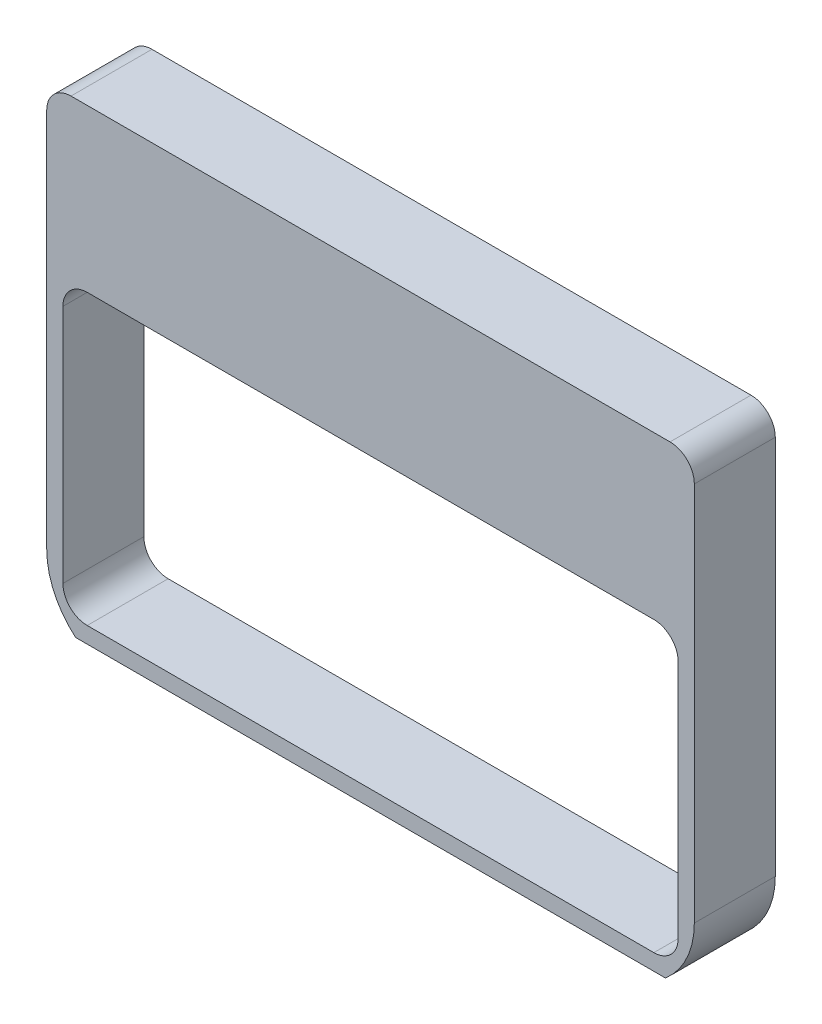
ISO-10303-21;
HEADER;
FILE_DESCRIPTION(('STEP AP214'),'2;1');
FILE_NAME('part.step','',(''),(''),'','','');
FILE_SCHEMA(('AUTOMOTIVE_DESIGN { 1 0 10303 214 1 1 1 1 }'));
ENDSEC;
DATA;
#1=APPLICATION_CONTEXT('core data for automotive mechanical design processes');
#2=APPLICATION_PROTOCOL_DEFINITION('international standard','automotive_design',2000,#1);
#3=PRODUCT_CONTEXT('',#1,'mechanical');
#4=PRODUCT('Part','Part','',(#3));
#5=PRODUCT_RELATED_PRODUCT_CATEGORY('part','',(#4));
#6=PRODUCT_DEFINITION_FORMATION('','',#4);
#7=PRODUCT_DEFINITION_CONTEXT('part definition',#1,'design');
#8=PRODUCT_DEFINITION('design','',#6,#7);
#9=PRODUCT_DEFINITION_SHAPE('','',#8);
#10=(LENGTH_UNIT() NAMED_UNIT(*) SI_UNIT(.MILLI.,.METRE.));
#11=(NAMED_UNIT(*) PLANE_ANGLE_UNIT() SI_UNIT($,.RADIAN.));
#12=(NAMED_UNIT(*) SI_UNIT($,.STERADIAN.) SOLID_ANGLE_UNIT());
#13=UNCERTAINTY_MEASURE_WITH_UNIT(LENGTH_MEASURE(1.E-05),#10,'distance_accuracy_value','');
#14=(GEOMETRIC_REPRESENTATION_CONTEXT(3) GLOBAL_UNCERTAINTY_ASSIGNED_CONTEXT((#13)) GLOBAL_UNIT_ASSIGNED_CONTEXT((#10,
#11,#12)) REPRESENTATION_CONTEXT('',''));
#15=CARTESIAN_POINT('',(0.,0.,0.));
#16=DIRECTION('',(0.,0.,1.));
#17=DIRECTION('',(1.,0.,0.));
#18=AXIS2_PLACEMENT_3D('',#15,#16,#17);
#19=CARTESIAN_POINT('',(27.4361140510487,78.3989030130212,10.));
#20=DIRECTION('',(-1.,0.,0.));
#21=DIRECTION('',(0.,0.,1.));
#22=AXIS2_PLACEMENT_3D('',#19,#20,#21);
#23=PLANE('',#22);
#24=DIRECTION('',(0.,1.,0.));
#25=VECTOR('',#24,1.);
#26=CARTESIAN_POINT('',(27.4361140510487,78.3989030130212,0.));
#27=LINE('',#26,#25);
#28=CARTESIAN_POINT('',(27.4361140510487,43.4189030130212,0.));
#29=VERTEX_POINT('',#28);
#30=CARTESIAN_POINT('',(27.4361140510487,90.3989030130211,0.));
#31=VERTEX_POINT('',#30);
#32=EDGE_CURVE('E220',#29,#31,#27,.T.);
#33=ORIENTED_EDGE('',*,*,#32,.T.);
#34=DIRECTION('',(0.,0.,-1.));
#35=VECTOR('',#34,1.);
#36=CARTESIAN_POINT('',(27.4361140510487,90.3989030130211,10.));
#37=LINE('',#36,#35);
#38=CARTESIAN_POINT('',(27.4361140510487,90.3989030130211,10.));
#39=VERTEX_POINT('',#38);
#40=EDGE_CURVE('E11',#39,#31,#37,.T.);
#41=ORIENTED_EDGE('',*,*,#40,.F.);
#42=DIRECTION('',(0.,-1.,0.));
#43=VECTOR('',#42,1.);
#44=CARTESIAN_POINT('',(27.4361140510487,78.3989030130212,10.));
#45=LINE('',#44,#43);
#46=CARTESIAN_POINT('',(27.4361140510487,43.4189030130212,10.));
#47=VERTEX_POINT('',#46);
#48=EDGE_CURVE('E216',#39,#47,#45,.T.);
#49=ORIENTED_EDGE('',*,*,#48,.T.);
#50=DIRECTION('',(0.,0.,-1.));
#51=VECTOR('',#50,1.);
#52=CARTESIAN_POINT('',(27.4361140510487,43.4189030130212,10.));
#53=LINE('',#52,#51);
#54=EDGE_CURVE('E37',#47,#29,#53,.T.);
#55=ORIENTED_EDGE('',*,*,#54,.T.);
#56=EDGE_LOOP('',(#33,#41,#49,#55));
#57=FACE_BOUND('',#56,.T.);
#58=ADVANCED_FACE('F33',(#57),#23,.F.);
#59=CARTESIAN_POINT('',(24.4361140510487,90.3989030130211,10.));
#60=DIRECTION('',(0.,0.,-1.));
#61=DIRECTION('',(-1.,0.,0.));
#62=AXIS2_PLACEMENT_3D('',#59,#60,#61);
#63=CYLINDRICAL_SURFACE('',#62,3.);
#64=CARTESIAN_POINT('',(24.4361140510487,90.3989030130211,0.));
#65=DIRECTION('',(0.,0.,-1.));
#66=DIRECTION('',(-1.,0.,0.));
#67=AXIS2_PLACEMENT_3D('',#64,#65,#66);
#68=CIRCLE('',#67,3.);
#69=CARTESIAN_POINT('',(24.4361140510487,93.3989030130211,0.));
#70=VERTEX_POINT('',#69);
#71=EDGE_CURVE('E256',#70,#31,#68,.T.);
#72=ORIENTED_EDGE('',*,*,#71,.F.);
#73=DIRECTION('',(0.,0.,-1.));
#74=VECTOR('',#73,1.);
#75=CARTESIAN_POINT('',(24.4361140510487,93.3989030130211,10.));
#76=LINE('',#75,#74);
#77=CARTESIAN_POINT('',(24.4361140510487,93.3989030130211,10.));
#78=VERTEX_POINT('',#77);
#79=EDGE_CURVE('E42',#78,#70,#76,.T.);
#80=ORIENTED_EDGE('',*,*,#79,.F.);
#81=CARTESIAN_POINT('',(24.4361140510487,90.3989030130211,10.));
#82=DIRECTION('',(0.,0.,-1.));
#83=DIRECTION('',(-1.,0.,0.));
#84=AXIS2_PLACEMENT_3D('',#81,#82,#83);
#85=CIRCLE('',#84,3.);
#86=EDGE_CURVE('E236',#78,#39,#85,.T.);
#87=ORIENTED_EDGE('',*,*,#86,.T.);
#88=ORIENTED_EDGE('',*,*,#40,.T.);
#89=EDGE_LOOP('',(#72,#80,#87,#88));
#90=FACE_BOUND('',#89,.T.);
#91=ADVANCED_FACE('F302',(#90),#63,.T.);
#92=CARTESIAN_POINT('',(-49.5638859489513,93.3989030130211,10.));
#93=DIRECTION('',(0.,1.,0.));
#94=DIRECTION('',(0.,0.,1.));
#95=AXIS2_PLACEMENT_3D('',#92,#93,#94);
#96=PLANE('',#95);
#97=DIRECTION('',(1.,0.,0.));
#98=VECTOR('',#97,1.);
#99=CARTESIAN_POINT('',(-49.5638859489513,93.3989030130211,0.));
#100=LINE('',#99,#98);
#101=CARTESIAN_POINT('',(-49.5638859489513,93.3989030130211,0.));
#102=VERTEX_POINT('',#101);
#103=EDGE_CURVE('E253',#102,#70,#100,.T.);
#104=ORIENTED_EDGE('',*,*,#103,.F.);
#105=DIRECTION('',(0.,0.,-1.));
#106=VECTOR('',#105,1.);
#107=CARTESIAN_POINT('',(-49.5638859489513,93.3989030130211,10.));
#108=LINE('',#107,#106);
#109=CARTESIAN_POINT('',(-49.5638859489513,93.3989030130211,10.));
#110=VERTEX_POINT('',#109);
#111=EDGE_CURVE('E262',#110,#102,#108,.T.);
#112=ORIENTED_EDGE('',*,*,#111,.F.);
#113=DIRECTION('',(1.,0.,0.));
#114=VECTOR('',#113,1.);
#115=CARTESIAN_POINT('',(-49.5638859489513,93.3989030130211,10.));
#116=LINE('',#115,#114);
#117=EDGE_CURVE('E233',#110,#78,#116,.T.);
#118=ORIENTED_EDGE('',*,*,#117,.T.);
#119=ORIENTED_EDGE('',*,*,#79,.T.);
#120=EDGE_LOOP('',(#104,#112,#118,#119));
#121=FACE_BOUND('',#120,.T.);
#122=ADVANCED_FACE('F299',(#121),#96,.T.);
#123=CARTESIAN_POINT('',(-49.5638859489513,90.3989030130211,10.));
#124=DIRECTION('',(0.,0.,-1.));
#125=DIRECTION('',(-1.,0.,0.));
#126=AXIS2_PLACEMENT_3D('',#123,#124,#125);
#127=CYLINDRICAL_SURFACE('',#126,3.);
#128=CARTESIAN_POINT('',(-49.5638859489513,90.3989030130211,0.));
#129=DIRECTION('',(0.,0.,-1.));
#130=DIRECTION('',(-1.,0.,0.));
#131=AXIS2_PLACEMENT_3D('',#128,#129,#130);
#132=CIRCLE('',#131,3.);
#133=CARTESIAN_POINT('',(-52.5638859489513,90.3989030130211,0.));
#134=VERTEX_POINT('',#133);
#135=EDGE_CURVE('E250',#134,#102,#132,.T.);
#136=ORIENTED_EDGE('',*,*,#135,.F.);
#137=DIRECTION('',(0.,0.,-1.));
#138=VECTOR('',#137,1.);
#139=CARTESIAN_POINT('',(-52.5638859489513,90.3989030130211,10.));
#140=LINE('',#139,#138);
#141=CARTESIAN_POINT('',(-52.5638859489513,90.3989030130211,10.));
#142=VERTEX_POINT('',#141);
#143=EDGE_CURVE('E264',#142,#134,#140,.T.);
#144=ORIENTED_EDGE('',*,*,#143,.F.);
#145=CARTESIAN_POINT('',(-49.5638859489513,90.3989030130211,10.));
#146=DIRECTION('',(0.,0.,-1.));
#147=DIRECTION('',(-1.,0.,0.));
#148=AXIS2_PLACEMENT_3D('',#145,#146,#147);
#149=CIRCLE('',#148,3.);
#150=EDGE_CURVE('E230',#142,#110,#149,.T.);
#151=ORIENTED_EDGE('',*,*,#150,.T.);
#152=ORIENTED_EDGE('',*,*,#111,.T.);
#153=EDGE_LOOP('',(#136,#144,#151,#152));
#154=FACE_BOUND('',#153,.T.);
#155=ADVANCED_FACE('F295',(#154),#127,.T.);
#156=CARTESIAN_POINT('',(-52.5638859489513,78.3989030130212,10.));
#157=DIRECTION('',(-1.,0.,0.));
#158=DIRECTION('',(0.,0.,1.));
#159=AXIS2_PLACEMENT_3D('',#156,#157,#158);
#160=PLANE('',#159);
#161=DIRECTION('',(0.,1.,0.));
#162=VECTOR('',#161,1.);
#163=CARTESIAN_POINT('',(-52.5638859489513,78.3989030130212,0.));
#164=LINE('',#163,#162);
#165=CARTESIAN_POINT('',(-52.5638859489513,43.4189030130212,0.));
#166=VERTEX_POINT('',#165);
#167=EDGE_CURVE('E247',#166,#134,#164,.T.);
#168=ORIENTED_EDGE('',*,*,#167,.F.);
#169=DIRECTION('',(0.,0.,-1.));
#170=VECTOR('',#169,1.);
#171=CARTESIAN_POINT('',(-52.5638859489513,43.4189030130212,10.));
#172=LINE('',#171,#170);
#173=CARTESIAN_POINT('',(-52.5638859489513,43.4189030130212,10.));
#174=VERTEX_POINT('',#173);
#175=EDGE_CURVE('E266',#174,#166,#172,.T.);
#176=ORIENTED_EDGE('',*,*,#175,.F.);
#177=DIRECTION('',(0.,-1.,0.));
#178=VECTOR('',#177,1.);
#179=CARTESIAN_POINT('',(-52.5638859489513,78.3989030130212,10.));
#180=LINE('',#179,#178);
#181=EDGE_CURVE('E228',#142,#174,#180,.T.);
#182=ORIENTED_EDGE('',*,*,#181,.F.);
#183=ORIENTED_EDGE('',*,*,#143,.T.);
#184=EDGE_LOOP('',(#168,#176,#182,#183));
#185=FACE_BOUND('',#184,.T.);
#186=ADVANCED_FACE('F291',(#185),#160,.T.);
#187=CARTESIAN_POINT('',(-42.5638859489513,43.4189030130212,10.));
#188=DIRECTION('',(0.,0.,-1.));
#189=DIRECTION('',(-1.,0.,0.));
#190=AXIS2_PLACEMENT_3D('',#187,#188,#189);
#191=CYLINDRICAL_SURFACE('',#190,10.);
#192=CARTESIAN_POINT('',(-42.5638859489513,43.4189030130212,0.));
#193=DIRECTION('',(0.,0.,-1.));
#194=DIRECTION('',(-1.,0.,0.));
#195=AXIS2_PLACEMENT_3D('',#192,#193,#194);
#196=CIRCLE('',#195,10.);
#197=CARTESIAN_POINT('',(-48.9917620458167,35.7584585818314,0.));
#198=VERTEX_POINT('',#197);
#199=EDGE_CURVE('E244',#198,#166,#196,.T.);
#200=ORIENTED_EDGE('',*,*,#199,.F.);
#201=DIRECTION('',(0.,0.,-1.));
#202=VECTOR('',#201,1.);
#203=CARTESIAN_POINT('',(-48.9917620458167,35.7584585818314,10.));
#204=LINE('',#203,#202);
#205=CARTESIAN_POINT('',(-48.9917620458167,35.7584585818314,10.));
#206=VERTEX_POINT('',#205);
#207=EDGE_CURVE('E269',#206,#198,#204,.T.);
#208=ORIENTED_EDGE('',*,*,#207,.F.);
#209=CARTESIAN_POINT('',(-42.5638859489513,43.4189030130212,10.));
#210=DIRECTION('',(0.,0.,-1.));
#211=DIRECTION('',(-1.,0.,0.));
#212=AXIS2_PLACEMENT_3D('',#209,#210,#211);
#213=CIRCLE('',#212,10.);
#214=EDGE_CURVE('E225',#206,#174,#213,.T.);
#215=ORIENTED_EDGE('',*,*,#214,.T.);
#216=ORIENTED_EDGE('',*,*,#175,.T.);
#217=EDGE_LOOP('',(#200,#208,#215,#216));
#218=FACE_BOUND('',#217,.T.);
#219=ADVANCED_FACE('F287',(#218),#191,.T.);
#220=CARTESIAN_POINT('',(23.8639901479141,35.7584585818314,10.));
#221=DIRECTION('',(0.,-1.,0.));
#222=DIRECTION('',(0.,0.,-1.));
#223=AXIS2_PLACEMENT_3D('',#220,#221,#222);
#224=PLANE('',#223);
#225=DIRECTION('',(-1.,0.,0.));
#226=VECTOR('',#225,1.);
#227=CARTESIAN_POINT('',(23.8639901479141,35.7584585818314,0.));
#228=LINE('',#227,#226);
#229=CARTESIAN_POINT('',(23.8639901479141,35.7584585818314,0.));
#230=VERTEX_POINT('',#229);
#231=EDGE_CURVE('E241',#230,#198,#228,.T.);
#232=ORIENTED_EDGE('',*,*,#231,.F.);
#233=DIRECTION('',(0.,0.,-1.));
#234=VECTOR('',#233,1.);
#235=CARTESIAN_POINT('',(23.8639901479141,35.7584585818314,10.));
#236=LINE('',#235,#234);
#237=CARTESIAN_POINT('',(23.8639901479141,35.7584585818314,10.));
#238=VERTEX_POINT('',#237);
#239=EDGE_CURVE('E270',#238,#230,#236,.T.);
#240=ORIENTED_EDGE('',*,*,#239,.F.);
#241=DIRECTION('',(-1.,0.,0.));
#242=VECTOR('',#241,1.);
#243=CARTESIAN_POINT('',(23.8639901479141,35.7584585818314,10.));
#244=LINE('',#243,#242);
#245=EDGE_CURVE('E222',#238,#206,#244,.T.);
#246=ORIENTED_EDGE('',*,*,#245,.T.);
#247=ORIENTED_EDGE('',*,*,#207,.T.);
#248=EDGE_LOOP('',(#232,#240,#246,#247));
#249=FACE_BOUND('',#248,.T.);
#250=ADVANCED_FACE('F282',(#249),#224,.T.);
#251=CARTESIAN_POINT('',(17.4361140510487,43.4189030130212,10.));
#252=DIRECTION('',(0.,0.,-1.));
#253=DIRECTION('',(-1.,0.,0.));
#254=AXIS2_PLACEMENT_3D('',#251,#252,#253);
#255=CYLINDRICAL_SURFACE('',#254,10.);
#256=CARTESIAN_POINT('',(17.4361140510487,43.4189030130212,0.));
#257=DIRECTION('',(0.,0.,1.));
#258=DIRECTION('',(1.,0.,0.));
#259=AXIS2_PLACEMENT_3D('',#256,#257,#258);
#260=CIRCLE('',#259,10.);
#261=EDGE_CURVE('E204',#230,#29,#260,.T.);
#262=ORIENTED_EDGE('',*,*,#261,.T.);
#263=ORIENTED_EDGE('',*,*,#54,.F.);
#264=CARTESIAN_POINT('',(17.4361140510487,43.4189030130212,10.));
#265=DIRECTION('',(0.,0.,1.));
#266=DIRECTION('',(1.,0.,0.));
#267=AXIS2_PLACEMENT_3D('',#264,#265,#266);
#268=CIRCLE('',#267,10.);
#269=EDGE_CURVE('E219',#238,#47,#268,.T.);
#270=ORIENTED_EDGE('',*,*,#269,.F.);
#271=ORIENTED_EDGE('',*,*,#239,.T.);
#272=EDGE_LOOP('',(#262,#263,#270,#271));
#273=FACE_BOUND('',#272,.T.);
#274=ADVANCED_FACE('F35',(#273),#255,.T.);
#275=CARTESIAN_POINT('',(17.4361140510487,43.4189030130212,10.));
#276=DIRECTION('',(0.,0.,1.));
#277=DIRECTION('',(1.,0.,0.));
#278=AXIS2_PLACEMENT_3D('',#275,#276,#277);
#279=PLANE('',#278);
#280=CARTESIAN_POINT('',(-47.5638859489513,70.3989030130211,10.));
#281=DIRECTION('',(0.,0.,-1.));
#282=DIRECTION('',(1.,0.,0.));
#283=AXIS2_PLACEMENT_3D('',#280,#281,#282);
#284=CIRCLE('',#283,3.);
#285=CARTESIAN_POINT('',(-50.5638859489513,70.3989030130211,10.));
#286=VERTEX_POINT('',#285);
#287=CARTESIAN_POINT('',(-47.5638859489513,73.3989030130211,10.));
#288=VERTEX_POINT('',#287);
#289=EDGE_CURVE('E149',#286,#288,#284,.T.);
#290=ORIENTED_EDGE('',*,*,#289,.T.);
#291=DIRECTION('',(1.,0.,0.));
#292=VECTOR('',#291,1.);
#293=CARTESIAN_POINT('',(22.4361140510487,73.3989030130211,10.));
#294=LINE('',#293,#292);
#295=CARTESIAN_POINT('',(22.4361140510487,73.3989030130211,10.));
#296=VERTEX_POINT('',#295);
#297=EDGE_CURVE('E158',#288,#296,#294,.T.);
#298=ORIENTED_EDGE('',*,*,#297,.T.);
#299=CARTESIAN_POINT('',(22.4361140510487,70.3989030130211,10.));
#300=DIRECTION('',(0.,0.,-1.));
#301=DIRECTION('',(-1.,0.,0.));
#302=AXIS2_PLACEMENT_3D('',#299,#300,#301);
#303=CIRCLE('',#302,3.);
#304=CARTESIAN_POINT('',(25.4361140510487,70.3989030130211,10.));
#305=VERTEX_POINT('',#304);
#306=EDGE_CURVE('E50',#296,#305,#303,.T.);
#307=ORIENTED_EDGE('',*,*,#306,.T.);
#308=DIRECTION('',(0.,-1.,0.));
#309=VECTOR('',#308,1.);
#310=CARTESIAN_POINT('',(25.4361140510487,70.3989030130211,10.));
#311=LINE('',#310,#309);
#312=CARTESIAN_POINT('',(25.4361140510487,40.7584585818314,10.));
#313=VERTEX_POINT('',#312);
#314=EDGE_CURVE('E173',#305,#313,#311,.T.);
#315=ORIENTED_EDGE('',*,*,#314,.T.);
#316=CARTESIAN_POINT('',(22.4361140510487,40.7584585818314,10.));
#317=DIRECTION('',(0.,0.,-1.));
#318=DIRECTION('',(-1.,0.,0.));
#319=AXIS2_PLACEMENT_3D('',#316,#317,#318);
#320=CIRCLE('',#319,3.);
#321=CARTESIAN_POINT('',(22.4361140510487,37.7584585818314,10.));
#322=VERTEX_POINT('',#321);
#323=EDGE_CURVE('E176',#313,#322,#320,.T.);
#324=ORIENTED_EDGE('',*,*,#323,.T.);
#325=DIRECTION('',(-1.,0.,0.));
#326=VECTOR('',#325,1.);
#327=CARTESIAN_POINT('',(22.4361140510487,37.7584585818314,10.));
#328=LINE('',#327,#326);
#329=CARTESIAN_POINT('',(-47.5638859489513,37.7584585818314,10.));
#330=VERTEX_POINT('',#329);
#331=EDGE_CURVE('E179',#322,#330,#328,.T.);
#332=ORIENTED_EDGE('',*,*,#331,.T.);
#333=CARTESIAN_POINT('',(-47.5638859489513,40.7584585818314,10.));
#334=DIRECTION('',(0.,0.,-1.));
#335=DIRECTION('',(-1.,0.,0.));
#336=AXIS2_PLACEMENT_3D('',#333,#334,#335);
#337=CIRCLE('',#336,3.);
#338=CARTESIAN_POINT('',(-50.5638859489513,40.7584585818314,10.));
#339=VERTEX_POINT('',#338);
#340=EDGE_CURVE('E182',#330,#339,#337,.T.);
#341=ORIENTED_EDGE('',*,*,#340,.T.);
#342=DIRECTION('',(0.,1.,0.));
#343=VECTOR('',#342,1.);
#344=CARTESIAN_POINT('',(-50.5638859489513,70.3989030130211,10.));
#345=LINE('',#344,#343);
#346=EDGE_CURVE('E155',#339,#286,#345,.T.);
#347=ORIENTED_EDGE('',*,*,#346,.T.);
#348=EDGE_LOOP('',(#290,#298,#307,#315,#324,#332,#341,#347));
#349=FACE_BOUND('',#348,.T.);
#350=ORIENTED_EDGE('',*,*,#48,.F.);
#351=ORIENTED_EDGE('',*,*,#86,.F.);
#352=ORIENTED_EDGE('',*,*,#117,.F.);
#353=ORIENTED_EDGE('',*,*,#150,.F.);
#354=ORIENTED_EDGE('',*,*,#181,.T.);
#355=ORIENTED_EDGE('',*,*,#214,.F.);
#356=ORIENTED_EDGE('',*,*,#245,.F.);
#357=ORIENTED_EDGE('',*,*,#269,.T.);
#358=EDGE_LOOP('',(#350,#351,#352,#353,#354,#355,#356,#357));
#359=FACE_BOUND('',#358,.T.);
#360=ADVANCED_FACE('F162',(#349,#359),#279,.T.);
#361=CARTESIAN_POINT('',(17.4361140510487,43.4189030130212,0.));
#362=DIRECTION('',(0.,0.,1.));
#363=DIRECTION('',(1.,0.,0.));
#364=AXIS2_PLACEMENT_3D('',#361,#362,#363);
#365=PLANE('',#364);
#366=DIRECTION('',(1.,0.,0.));
#367=VECTOR('',#366,1.);
#368=CARTESIAN_POINT('',(22.4361140510487,73.3989030130211,0.));
#369=LINE('',#368,#367);
#370=CARTESIAN_POINT('',(-47.5638859489513,73.3989030130211,0.));
#371=VERTEX_POINT('',#370);
#372=CARTESIAN_POINT('',(22.4361140510487,73.3989030130211,0.));
#373=VERTEX_POINT('',#372);
#374=EDGE_CURVE('E186',#371,#373,#369,.T.);
#375=ORIENTED_EDGE('',*,*,#374,.F.);
#376=CARTESIAN_POINT('',(-47.5638859489513,70.3989030130211,0.));
#377=DIRECTION('',(0.,0.,-1.));
#378=DIRECTION('',(1.,0.,0.));
#379=AXIS2_PLACEMENT_3D('',#376,#377,#378);
#380=CIRCLE('',#379,3.);
#381=CARTESIAN_POINT('',(-50.5638859489513,70.3989030130211,0.));
#382=VERTEX_POINT('',#381);
#383=EDGE_CURVE('E58',#382,#371,#380,.T.);
#384=ORIENTED_EDGE('',*,*,#383,.F.);
#385=DIRECTION('',(0.,1.,0.));
#386=VECTOR('',#385,1.);
#387=CARTESIAN_POINT('',(-50.5638859489513,70.3989030130211,0.));
#388=LINE('',#387,#386);
#389=CARTESIAN_POINT('',(-50.5638859489513,40.7584585818314,0.));
#390=VERTEX_POINT('',#389);
#391=EDGE_CURVE('E166',#390,#382,#388,.T.);
#392=ORIENTED_EDGE('',*,*,#391,.F.);
#393=CARTESIAN_POINT('',(-47.5638859489513,40.7584585818314,0.));
#394=DIRECTION('',(0.,0.,-1.));
#395=DIRECTION('',(-1.,0.,0.));
#396=AXIS2_PLACEMENT_3D('',#393,#394,#395);
#397=CIRCLE('',#396,3.);
#398=CARTESIAN_POINT('',(-47.5638859489513,37.7584585818314,0.));
#399=VERTEX_POINT('',#398);
#400=EDGE_CURVE('E169',#399,#390,#397,.T.);
#401=ORIENTED_EDGE('',*,*,#400,.F.);
#402=DIRECTION('',(-1.,0.,0.));
#403=VECTOR('',#402,1.);
#404=CARTESIAN_POINT('',(22.4361140510487,37.7584585818314,0.));
#405=LINE('',#404,#403);
#406=CARTESIAN_POINT('',(22.4361140510487,37.7584585818314,0.));
#407=VERTEX_POINT('',#406);
#408=EDGE_CURVE('E197',#407,#399,#405,.T.);
#409=ORIENTED_EDGE('',*,*,#408,.F.);
#410=CARTESIAN_POINT('',(22.4361140510487,40.7584585818314,0.));
#411=DIRECTION('',(0.,0.,-1.));
#412=DIRECTION('',(-1.,0.,0.));
#413=AXIS2_PLACEMENT_3D('',#410,#411,#412);
#414=CIRCLE('',#413,3.);
#415=CARTESIAN_POINT('',(25.4361140510487,40.7584585818314,0.));
#416=VERTEX_POINT('',#415);
#417=EDGE_CURVE('E194',#416,#407,#414,.T.);
#418=ORIENTED_EDGE('',*,*,#417,.F.);
#419=DIRECTION('',(0.,-1.,0.));
#420=VECTOR('',#419,1.);
#421=CARTESIAN_POINT('',(25.4361140510487,70.3989030130211,0.));
#422=LINE('',#421,#420);
#423=CARTESIAN_POINT('',(25.4361140510487,70.3989030130211,0.));
#424=VERTEX_POINT('',#423);
#425=EDGE_CURVE('E191',#424,#416,#422,.T.);
#426=ORIENTED_EDGE('',*,*,#425,.F.);
#427=CARTESIAN_POINT('',(22.4361140510487,70.3989030130211,0.));
#428=DIRECTION('',(0.,0.,-1.));
#429=DIRECTION('',(-1.,0.,0.));
#430=AXIS2_PLACEMENT_3D('',#427,#428,#429);
#431=CIRCLE('',#430,3.);
#432=EDGE_CURVE('E188',#373,#424,#431,.T.);
#433=ORIENTED_EDGE('',*,*,#432,.F.);
#434=EDGE_LOOP('',(#375,#384,#392,#401,#409,#418,#426,#433));
#435=FACE_BOUND('',#434,.T.);
#436=ORIENTED_EDGE('',*,*,#32,.F.);
#437=ORIENTED_EDGE('',*,*,#261,.F.);
#438=ORIENTED_EDGE('',*,*,#231,.T.);
#439=ORIENTED_EDGE('',*,*,#199,.T.);
#440=ORIENTED_EDGE('',*,*,#167,.T.);
#441=ORIENTED_EDGE('',*,*,#135,.T.);
#442=ORIENTED_EDGE('',*,*,#103,.T.);
#443=ORIENTED_EDGE('',*,*,#71,.T.);
#444=EDGE_LOOP('',(#436,#437,#438,#439,#440,#441,#442,#443));
#445=FACE_BOUND('',#444,.T.);
#446=ADVANCED_FACE('F280',(#435,#445),#365,.F.);
#447=CARTESIAN_POINT('',(-47.5638859489513,70.3989030130211,10.));
#448=DIRECTION('',(0.,0.,-1.));
#449=DIRECTION('',(-1.,0.,0.));
#450=AXIS2_PLACEMENT_3D('',#447,#448,#449);
#451=CYLINDRICAL_SURFACE('',#450,3.);
#452=ORIENTED_EDGE('',*,*,#383,.T.);
#453=DIRECTION('',(0.,0.,-1.));
#454=VECTOR('',#453,1.);
#455=CARTESIAN_POINT('',(-47.5638859489513,73.3989030130211,10.));
#456=LINE('',#455,#454);
#457=EDGE_CURVE('E145',#288,#371,#456,.T.);
#458=ORIENTED_EDGE('',*,*,#457,.F.);
#459=ORIENTED_EDGE('',*,*,#289,.F.);
#460=DIRECTION('',(0.,0.,-1.));
#461=VECTOR('',#460,1.);
#462=CARTESIAN_POINT('',(-50.5638859489513,70.3989030130211,10.));
#463=LINE('',#462,#461);
#464=EDGE_CURVE('E202',#286,#382,#463,.T.);
#465=ORIENTED_EDGE('',*,*,#464,.T.);
#466=EDGE_LOOP('',(#452,#458,#459,#465));
#467=FACE_BOUND('',#466,.T.);
#468=ADVANCED_FACE('F147',(#467),#451,.F.);
#469=CARTESIAN_POINT('',(-50.5638859489513,70.3989030130211,10.));
#470=DIRECTION('',(-1.,0.,0.));
#471=DIRECTION('',(0.,0.,1.));
#472=AXIS2_PLACEMENT_3D('',#469,#470,#471);
#473=PLANE('',#472);
#474=ORIENTED_EDGE('',*,*,#391,.T.);
#475=ORIENTED_EDGE('',*,*,#464,.F.);
#476=ORIENTED_EDGE('',*,*,#346,.F.);
#477=DIRECTION('',(0.,0.,-1.));
#478=VECTOR('',#477,1.);
#479=CARTESIAN_POINT('',(-50.5638859489513,40.7584585818314,10.));
#480=LINE('',#479,#478);
#481=EDGE_CURVE('E205',#339,#390,#480,.T.);
#482=ORIENTED_EDGE('',*,*,#481,.T.);
#483=EDGE_LOOP('',(#474,#475,#476,#482));
#484=FACE_BOUND('',#483,.T.);
#485=ADVANCED_FACE('F355',(#484),#473,.F.);
#486=CARTESIAN_POINT('',(-47.5638859489513,40.7584585818314,10.));
#487=DIRECTION('',(0.,0.,-1.));
#488=DIRECTION('',(-1.,0.,0.));
#489=AXIS2_PLACEMENT_3D('',#486,#487,#488);
#490=CYLINDRICAL_SURFACE('',#489,3.);
#491=ORIENTED_EDGE('',*,*,#400,.T.);
#492=ORIENTED_EDGE('',*,*,#481,.F.);
#493=ORIENTED_EDGE('',*,*,#340,.F.);
#494=DIRECTION('',(0.,0.,-1.));
#495=VECTOR('',#494,1.);
#496=CARTESIAN_POINT('',(-47.5638859489513,37.7584585818314,10.));
#497=LINE('',#496,#495);
#498=EDGE_CURVE('E207',#330,#399,#497,.T.);
#499=ORIENTED_EDGE('',*,*,#498,.T.);
#500=EDGE_LOOP('',(#491,#492,#493,#499));
#501=FACE_BOUND('',#500,.T.);
#502=ADVANCED_FACE('F363',(#501),#490,.F.);
#503=CARTESIAN_POINT('',(22.4361140510487,37.7584585818314,10.));
#504=DIRECTION('',(0.,-1.,0.));
#505=DIRECTION('',(0.,0.,-1.));
#506=AXIS2_PLACEMENT_3D('',#503,#504,#505);
#507=PLANE('',#506);
#508=ORIENTED_EDGE('',*,*,#408,.T.);
#509=ORIENTED_EDGE('',*,*,#498,.F.);
#510=ORIENTED_EDGE('',*,*,#331,.F.);
#511=DIRECTION('',(0.,0.,-1.));
#512=VECTOR('',#511,1.);
#513=CARTESIAN_POINT('',(22.4361140510487,37.7584585818314,10.));
#514=LINE('',#513,#512);
#515=EDGE_CURVE('E209',#322,#407,#514,.T.);
#516=ORIENTED_EDGE('',*,*,#515,.T.);
#517=EDGE_LOOP('',(#508,#509,#510,#516));
#518=FACE_BOUND('',#517,.T.);
#519=ADVANCED_FACE('F373',(#518),#507,.F.);
#520=CARTESIAN_POINT('',(22.4361140510487,40.7584585818314,10.));
#521=DIRECTION('',(0.,0.,-1.));
#522=DIRECTION('',(-1.,0.,0.));
#523=AXIS2_PLACEMENT_3D('',#520,#521,#522);
#524=CYLINDRICAL_SURFACE('',#523,3.);
#525=ORIENTED_EDGE('',*,*,#417,.T.);
#526=ORIENTED_EDGE('',*,*,#515,.F.);
#527=ORIENTED_EDGE('',*,*,#323,.F.);
#528=DIRECTION('',(0.,0.,-1.));
#529=VECTOR('',#528,1.);
#530=CARTESIAN_POINT('',(25.4361140510487,40.7584585818314,10.));
#531=LINE('',#530,#529);
#532=EDGE_CURVE('E211',#313,#416,#531,.T.);
#533=ORIENTED_EDGE('',*,*,#532,.T.);
#534=EDGE_LOOP('',(#525,#526,#527,#533));
#535=FACE_BOUND('',#534,.T.);
#536=ADVANCED_FACE('F383',(#535),#524,.F.);
#537=CARTESIAN_POINT('',(25.4361140510487,70.3989030130211,10.));
#538=DIRECTION('',(1.,0.,0.));
#539=DIRECTION('',(0.,1.,0.));
#540=AXIS2_PLACEMENT_3D('',#537,#538,#539);
#541=PLANE('',#540);
#542=ORIENTED_EDGE('',*,*,#425,.T.);
#543=ORIENTED_EDGE('',*,*,#532,.F.);
#544=ORIENTED_EDGE('',*,*,#314,.F.);
#545=DIRECTION('',(0.,0.,-1.));
#546=VECTOR('',#545,1.);
#547=CARTESIAN_POINT('',(25.4361140510487,70.3989030130211,10.));
#548=LINE('',#547,#546);
#549=EDGE_CURVE('E213',#305,#424,#548,.T.);
#550=ORIENTED_EDGE('',*,*,#549,.T.);
#551=EDGE_LOOP('',(#542,#543,#544,#550));
#552=FACE_BOUND('',#551,.T.);
#553=ADVANCED_FACE('F393',(#552),#541,.F.);
#554=CARTESIAN_POINT('',(22.4361140510487,70.3989030130211,10.));
#555=DIRECTION('',(0.,0.,-1.));
#556=DIRECTION('',(-1.,0.,0.));
#557=AXIS2_PLACEMENT_3D('',#554,#555,#556);
#558=CYLINDRICAL_SURFACE('',#557,3.);
#559=ORIENTED_EDGE('',*,*,#432,.T.);
#560=ORIENTED_EDGE('',*,*,#549,.F.);
#561=ORIENTED_EDGE('',*,*,#306,.F.);
#562=DIRECTION('',(0.,0.,-1.));
#563=VECTOR('',#562,1.);
#564=CARTESIAN_POINT('',(22.4361140510487,73.3989030130211,10.));
#565=LINE('',#564,#563);
#566=EDGE_CURVE('E154',#296,#373,#565,.T.);
#567=ORIENTED_EDGE('',*,*,#566,.T.);
#568=EDGE_LOOP('',(#559,#560,#561,#567));
#569=FACE_BOUND('',#568,.T.);
#570=ADVANCED_FACE('F403',(#569),#558,.F.);
#571=CARTESIAN_POINT('',(22.4361140510487,73.3989030130211,10.));
#572=DIRECTION('',(0.,1.,0.));
#573=DIRECTION('',(0.,0.,1.));
#574=AXIS2_PLACEMENT_3D('',#571,#572,#573);
#575=PLANE('',#574);
#576=ORIENTED_EDGE('',*,*,#374,.T.);
#577=ORIENTED_EDGE('',*,*,#566,.F.);
#578=ORIENTED_EDGE('',*,*,#297,.F.);
#579=ORIENTED_EDGE('',*,*,#457,.T.);
#580=EDGE_LOOP('',(#576,#577,#578,#579));
#581=FACE_BOUND('',#580,.T.);
#582=ADVANCED_FACE('F159',(#581),#575,.F.);
#583=CLOSED_SHELL('',(#58,#91,#122,#155,#186,#219,#250,#274,#360,#446,#468,#485,#502,#519,#536,
#553,#570,#582));
#584=MANIFOLD_SOLID_BREP('B2',#583);
#585=ADVANCED_BREP_SHAPE_REPRESENTATION('',(#18,#584),#14);
#586=SHAPE_DEFINITION_REPRESENTATION(#9,#585);
ENDSEC;
END-ISO-10303-21;
